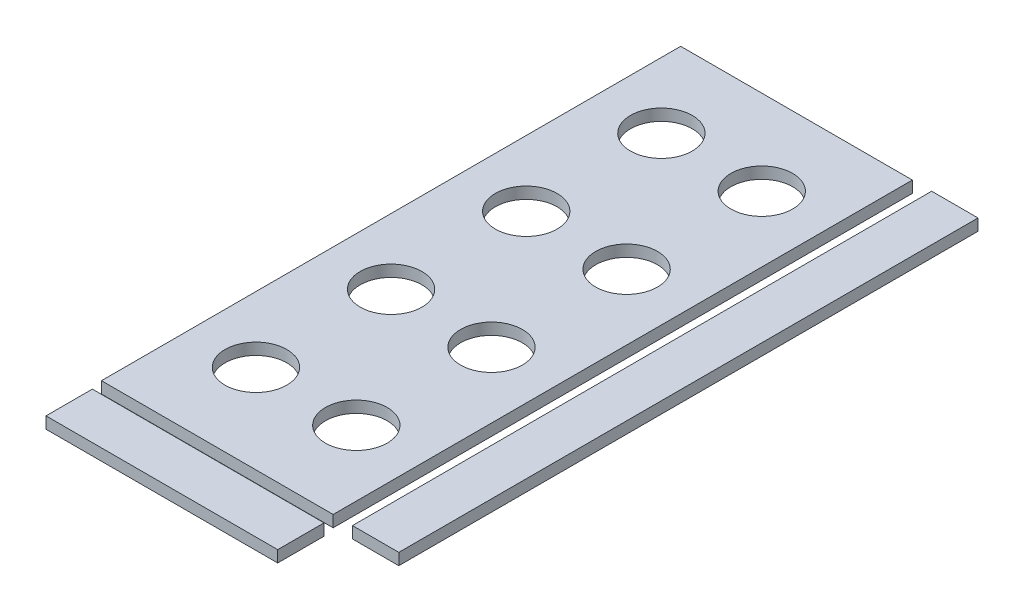
ISO-10303-21;
HEADER;
FILE_DESCRIPTION(('STEP AP214'),'2;1');
FILE_NAME('part.step','',(''),(''),'','','');
FILE_SCHEMA(('AUTOMOTIVE_DESIGN { 1 0 10303 214 1 1 1 1 }'));
ENDSEC;
DATA;
#1=APPLICATION_CONTEXT('core data for automotive mechanical design processes');
#2=APPLICATION_PROTOCOL_DEFINITION('international standard','automotive_design',2000,#1);
#3=PRODUCT_CONTEXT('',#1,'mechanical');
#4=PRODUCT('Part','Part','',(#3));
#5=PRODUCT_RELATED_PRODUCT_CATEGORY('part','',(#4));
#6=PRODUCT_DEFINITION_FORMATION('','',#4);
#7=PRODUCT_DEFINITION_CONTEXT('part definition',#1,'design');
#8=PRODUCT_DEFINITION('design','',#6,#7);
#9=PRODUCT_DEFINITION_SHAPE('','',#8);
#10=(LENGTH_UNIT() NAMED_UNIT(*) SI_UNIT(.MILLI.,.METRE.));
#11=(NAMED_UNIT(*) PLANE_ANGLE_UNIT() SI_UNIT($,.RADIAN.));
#12=(NAMED_UNIT(*) SI_UNIT($,.STERADIAN.) SOLID_ANGLE_UNIT());
#13=UNCERTAINTY_MEASURE_WITH_UNIT(LENGTH_MEASURE(1.E-05),#10,'distance_accuracy_value','');
#14=(GEOMETRIC_REPRESENTATION_CONTEXT(3) GLOBAL_UNCERTAINTY_ASSIGNED_CONTEXT((#13)) GLOBAL_UNIT_ASSIGNED_CONTEXT((#10,
#11,#12)) REPRESENTATION_CONTEXT('',''));
#15=CARTESIAN_POINT('',(0.,0.,0.));
#16=DIRECTION('',(0.,0.,1.));
#17=DIRECTION('',(1.,0.,0.));
#18=AXIS2_PLACEMENT_3D('',#15,#16,#17);
#19=CARTESIAN_POINT('',(-37.6701485217803,3.,27.4288459978406));
#20=DIRECTION('',(-3.66736733573939E-13,0.,-1.));
#21=DIRECTION('',(-1.,0.,3.66736733573939E-13));
#22=AXIS2_PLACEMENT_3D('',#19,#20,#21);
#23=PLANE('',#22);
#24=DIRECTION('',(1.,0.,-3.66736733573939E-13));
#25=VECTOR('',#24,1.);
#26=CARTESIAN_POINT('',(-37.6701485217803,0.,27.4288459978406));
#27=LINE('',#26,#25);
#28=CARTESIAN_POINT('',(-37.6701485217803,0.,27.4288459978406));
#29=VERTEX_POINT('',#28);
#30=CARTESIAN_POINT('',(22.3298514782197,0.,27.4288459978186));
#31=VERTEX_POINT('',#30);
#32=EDGE_CURVE('E107',#29,#31,#27,.T.);
#33=ORIENTED_EDGE('',*,*,#32,.T.);
#34=DIRECTION('',(0.,-1.,0.));
#35=VECTOR('',#34,1.);
#36=CARTESIAN_POINT('',(22.3298514782197,3.,27.4288459978186));
#37=LINE('',#36,#35);
#38=CARTESIAN_POINT('',(22.3298514782197,3.,27.4288459978186));
#39=VERTEX_POINT('',#38);
#40=EDGE_CURVE('E12',#39,#31,#37,.T.);
#41=ORIENTED_EDGE('',*,*,#40,.F.);
#42=DIRECTION('',(1.,0.,-3.66736733573939E-13));
#43=VECTOR('',#42,1.);
#44=CARTESIAN_POINT('',(-37.6701485217803,3.,27.4288459978406));
#45=LINE('',#44,#43);
#46=CARTESIAN_POINT('',(-37.6701485217803,3.,27.4288459978406));
#47=VERTEX_POINT('',#46);
#48=EDGE_CURVE('E95',#47,#39,#45,.T.);
#49=ORIENTED_EDGE('',*,*,#48,.F.);
#50=DIRECTION('',(0.,-1.,0.));
#51=VECTOR('',#50,1.);
#52=CARTESIAN_POINT('',(-37.6701485217803,3.,27.4288459978406));
#53=LINE('',#52,#51);
#54=EDGE_CURVE('E103',#47,#29,#53,.T.);
#55=ORIENTED_EDGE('',*,*,#54,.T.);
#56=EDGE_LOOP('',(#33,#41,#49,#55));
#57=FACE_BOUND('',#56,.T.);
#58=ADVANCED_FACE('F44',(#57),#23,.F.);
#59=CARTESIAN_POINT('',(22.3298514782197,3.,27.4288459978186));
#60=DIRECTION('',(-1.,0.,3.66505437110476E-13));
#61=DIRECTION('',(3.66505437110476E-13,0.,1.));
#62=AXIS2_PLACEMENT_3D('',#59,#60,#61);
#63=PLANE('',#62);
#64=DIRECTION('',(-3.66505437110476E-13,0.,-1.));
#65=VECTOR('',#64,1.);
#66=CARTESIAN_POINT('',(22.3298514782197,0.,27.4288459978186));
#67=LINE('',#66,#65);
#68=CARTESIAN_POINT('',(22.3298514782153,0.,15.4288459978186));
#69=VERTEX_POINT('',#68);
#70=EDGE_CURVE('E99',#31,#69,#67,.T.);
#71=ORIENTED_EDGE('',*,*,#70,.T.);
#72=DIRECTION('',(0.,-1.,0.));
#73=VECTOR('',#72,1.);
#74=CARTESIAN_POINT('',(22.3298514782153,3.,15.4288459978186));
#75=LINE('',#74,#73);
#76=CARTESIAN_POINT('',(22.3298514782153,3.,15.4288459978186));
#77=VERTEX_POINT('',#76);
#78=EDGE_CURVE('E52',#77,#69,#75,.T.);
#79=ORIENTED_EDGE('',*,*,#78,.F.);
#80=DIRECTION('',(-3.66505437110476E-13,0.,-1.));
#81=VECTOR('',#80,1.);
#82=CARTESIAN_POINT('',(22.3298514782197,3.,27.4288459978186));
#83=LINE('',#82,#81);
#84=EDGE_CURVE('E90',#39,#77,#83,.T.);
#85=ORIENTED_EDGE('',*,*,#84,.F.);
#86=ORIENTED_EDGE('',*,*,#40,.T.);
#87=EDGE_LOOP('',(#71,#79,#85,#86));
#88=FACE_BOUND('',#87,.T.);
#89=ADVANCED_FACE('F98',(#88),#63,.F.);
#90=CARTESIAN_POINT('',(-37.6701485217847,3.,15.4288459978406));
#91=DIRECTION('',(3.66505437110476E-13,0.,1.));
#92=DIRECTION('',(1.,0.,-3.66505437110476E-13));
#93=AXIS2_PLACEMENT_3D('',#90,#91,#92);
#94=PLANE('',#93);
#95=DIRECTION('',(-1.,0.,3.66505437110476E-13));
#96=VECTOR('',#95,1.);
#97=CARTESIAN_POINT('',(-37.6701485217847,0.,15.4288459978406));
#98=LINE('',#97,#96);
#99=CARTESIAN_POINT('',(-37.6701485217847,0.,15.4288459978406));
#100=VERTEX_POINT('',#99);
#101=EDGE_CURVE('E77',#69,#100,#98,.T.);
#102=ORIENTED_EDGE('',*,*,#101,.T.);
#103=DIRECTION('',(0.,-1.,0.));
#104=VECTOR('',#103,1.);
#105=CARTESIAN_POINT('',(-37.6701485217847,3.,15.4288459978406));
#106=LINE('',#105,#104);
#107=CARTESIAN_POINT('',(-37.6701485217847,3.,15.4288459978406));
#108=VERTEX_POINT('',#107);
#109=EDGE_CURVE('E100',#108,#100,#106,.T.);
#110=ORIENTED_EDGE('',*,*,#109,.F.);
#111=DIRECTION('',(-1.,0.,3.66505437110476E-13));
#112=VECTOR('',#111,1.);
#113=CARTESIAN_POINT('',(-37.6701485217847,3.,15.4288459978406));
#114=LINE('',#113,#112);
#115=EDGE_CURVE('E93',#77,#108,#114,.T.);
#116=ORIENTED_EDGE('',*,*,#115,.F.);
#117=ORIENTED_EDGE('',*,*,#78,.T.);
#118=EDGE_LOOP('',(#102,#110,#116,#117));
#119=FACE_BOUND('',#118,.T.);
#120=ADVANCED_FACE('F101',(#119),#94,.F.);
#121=CARTESIAN_POINT('',(-37.6701485217803,3.,27.4288459978406));
#122=DIRECTION('',(1.,0.,-3.66505437110476E-13));
#123=DIRECTION('',(-3.66505437110476E-13,0.,-1.));
#124=AXIS2_PLACEMENT_3D('',#121,#122,#123);
#125=PLANE('',#124);
#126=DIRECTION('',(3.66505437110476E-13,0.,1.));
#127=VECTOR('',#126,1.);
#128=CARTESIAN_POINT('',(-37.6701485217803,0.,27.4288459978406));
#129=LINE('',#128,#127);
#130=EDGE_CURVE('E83',#100,#29,#129,.T.);
#131=ORIENTED_EDGE('',*,*,#130,.T.);
#132=ORIENTED_EDGE('',*,*,#54,.F.);
#133=DIRECTION('',(3.66505437110476E-13,0.,1.));
#134=VECTOR('',#133,1.);
#135=CARTESIAN_POINT('',(-37.6701485217803,3.,27.4288459978406));
#136=LINE('',#135,#134);
#137=EDGE_CURVE('E60',#108,#47,#136,.T.);
#138=ORIENTED_EDGE('',*,*,#137,.F.);
#139=ORIENTED_EDGE('',*,*,#109,.T.);
#140=EDGE_LOOP('',(#131,#132,#138,#139));
#141=FACE_BOUND('',#140,.T.);
#142=ADVANCED_FACE('F114',(#141),#125,.F.);
#143=CARTESIAN_POINT('',(9.97415725046658,3.,71.0513108964191));
#144=DIRECTION('',(0.,1.,0.));
#145=DIRECTION('',(1.,0.,-3.66505437110476E-13));
#146=AXIS2_PLACEMENT_3D('',#143,#144,#145);
#147=PLANE('',#146);
#148=ORIENTED_EDGE('',*,*,#48,.T.);
#149=ORIENTED_EDGE('',*,*,#84,.T.);
#150=ORIENTED_EDGE('',*,*,#115,.T.);
#151=ORIENTED_EDGE('',*,*,#137,.T.);
#152=EDGE_LOOP('',(#148,#149,#150,#151));
#153=FACE_BOUND('',#152,.T.);
#154=ADVANCED_FACE('F91',(#153),#147,.T.);
#155=CARTESIAN_POINT('',(9.97415725046658,0.,71.0513108964191));
#156=DIRECTION('',(0.,1.,0.));
#157=DIRECTION('',(1.,0.,-3.66505437110476E-13));
#158=AXIS2_PLACEMENT_3D('',#155,#156,#157);
#159=PLANE('',#158);
#160=ORIENTED_EDGE('',*,*,#32,.F.);
#161=ORIENTED_EDGE('',*,*,#130,.F.);
#162=ORIENTED_EDGE('',*,*,#101,.F.);
#163=ORIENTED_EDGE('',*,*,#70,.F.);
#164=EDGE_LOOP('',(#160,#161,#162,#163));
#165=FACE_BOUND('',#164,.T.);
#166=ADVANCED_FACE('F117',(#165),#159,.F.);
#167=CLOSED_SHELL('',(#58,#89,#120,#142,#154,#166));
#168=MANIFOLD_SOLID_BREP('B2',#167);
#169=CARTESIAN_POINT('',(26.6224648985959,3.,-137.644305772231));
#170=DIRECTION('',(1.,0.,0.));
#171=DIRECTION('',(0.,0.,-1.));
#172=AXIS2_PLACEMENT_3D('',#169,#170,#171);
#173=PLANE('',#172);
#174=DIRECTION('',(0.,0.,1.));
#175=VECTOR('',#174,1.);
#176=CARTESIAN_POINT('',(26.6224648985959,0.,-137.644305772231));
#177=LINE('',#176,#175);
#178=CARTESIAN_POINT('',(26.6224648985959,0.,-137.644305772231));
#179=VERTEX_POINT('',#178);
#180=CARTESIAN_POINT('',(26.622464898596,0.,12.3556942277691));
#181=VERTEX_POINT('',#180);
#182=EDGE_CURVE('E240',#179,#181,#177,.T.);
#183=ORIENTED_EDGE('',*,*,#182,.T.);
#184=DIRECTION('',(0.,-1.,0.));
#185=VECTOR('',#184,1.);
#186=CARTESIAN_POINT('',(26.622464898596,3.,12.3556942277691));
#187=LINE('',#186,#185);
#188=CARTESIAN_POINT('',(26.622464898596,3.,12.3556942277691));
#189=VERTEX_POINT('',#188);
#190=EDGE_CURVE('E42',#189,#181,#187,.T.);
#191=ORIENTED_EDGE('',*,*,#190,.F.);
#192=DIRECTION('',(0.,0.,1.));
#193=VECTOR('',#192,1.);
#194=CARTESIAN_POINT('',(26.6224648985959,3.,-137.644305772231));
#195=LINE('',#194,#193);
#196=CARTESIAN_POINT('',(26.6224648985959,3.,-137.644305772231));
#197=VERTEX_POINT('',#196);
#198=EDGE_CURVE('E228',#197,#189,#195,.T.);
#199=ORIENTED_EDGE('',*,*,#198,.F.);
#200=DIRECTION('',(0.,-1.,0.));
#201=VECTOR('',#200,1.);
#202=CARTESIAN_POINT('',(26.6224648985959,3.,-137.644305772231));
#203=LINE('',#202,#201);
#204=EDGE_CURVE('E236',#197,#179,#203,.T.);
#205=ORIENTED_EDGE('',*,*,#204,.T.);
#206=EDGE_LOOP('',(#183,#191,#199,#205));
#207=FACE_BOUND('',#206,.T.);
#208=ADVANCED_FACE('F177',(#207),#173,.F.);
#209=CARTESIAN_POINT('',(26.622464898596,3.,12.3556942277691));
#210=DIRECTION('',(0.,0.,-1.));
#211=DIRECTION('',(-1.,0.,0.));
#212=AXIS2_PLACEMENT_3D('',#209,#210,#211);
#213=PLANE('',#212);
#214=DIRECTION('',(1.,0.,0.));
#215=VECTOR('',#214,1.);
#216=CARTESIAN_POINT('',(26.622464898596,0.,12.3556942277691));
#217=LINE('',#216,#215);
#218=CARTESIAN_POINT('',(38.622464898596,0.,12.3556942277691));
#219=VERTEX_POINT('',#218);
#220=EDGE_CURVE('E232',#181,#219,#217,.T.);
#221=ORIENTED_EDGE('',*,*,#220,.T.);
#222=DIRECTION('',(0.,-1.,0.));
#223=VECTOR('',#222,1.);
#224=CARTESIAN_POINT('',(38.622464898596,3.,12.3556942277691));
#225=LINE('',#224,#223);
#226=CARTESIAN_POINT('',(38.622464898596,3.,12.3556942277691));
#227=VERTEX_POINT('',#226);
#228=EDGE_CURVE('E185',#227,#219,#225,.T.);
#229=ORIENTED_EDGE('',*,*,#228,.F.);
#230=DIRECTION('',(1.,0.,0.));
#231=VECTOR('',#230,1.);
#232=CARTESIAN_POINT('',(26.622464898596,3.,12.3556942277691));
#233=LINE('',#232,#231);
#234=EDGE_CURVE('E223',#189,#227,#233,.T.);
#235=ORIENTED_EDGE('',*,*,#234,.F.);
#236=ORIENTED_EDGE('',*,*,#190,.T.);
#237=EDGE_LOOP('',(#221,#229,#235,#236));
#238=FACE_BOUND('',#237,.T.);
#239=ADVANCED_FACE('F231',(#238),#213,.F.);
#240=CARTESIAN_POINT('',(38.6224648985959,3.,-137.644305772231));
#241=DIRECTION('',(-1.,0.,0.));
#242=DIRECTION('',(0.,0.,1.));
#243=AXIS2_PLACEMENT_3D('',#240,#241,#242);
#244=PLANE('',#243);
#245=DIRECTION('',(0.,0.,-1.));
#246=VECTOR('',#245,1.);
#247=CARTESIAN_POINT('',(38.6224648985959,0.,-137.644305772231));
#248=LINE('',#247,#246);
#249=CARTESIAN_POINT('',(38.6224648985959,0.,-137.644305772231));
#250=VERTEX_POINT('',#249);
#251=EDGE_CURVE('E210',#219,#250,#248,.T.);
#252=ORIENTED_EDGE('',*,*,#251,.T.);
#253=DIRECTION('',(0.,-1.,0.));
#254=VECTOR('',#253,1.);
#255=CARTESIAN_POINT('',(38.6224648985959,3.,-137.644305772231));
#256=LINE('',#255,#254);
#257=CARTESIAN_POINT('',(38.6224648985959,3.,-137.644305772231));
#258=VERTEX_POINT('',#257);
#259=EDGE_CURVE('E233',#258,#250,#256,.T.);
#260=ORIENTED_EDGE('',*,*,#259,.F.);
#261=DIRECTION('',(0.,0.,-1.));
#262=VECTOR('',#261,1.);
#263=CARTESIAN_POINT('',(38.6224648985959,3.,-137.644305772231));
#264=LINE('',#263,#262);
#265=EDGE_CURVE('E226',#227,#258,#264,.T.);
#266=ORIENTED_EDGE('',*,*,#265,.F.);
#267=ORIENTED_EDGE('',*,*,#228,.T.);
#268=EDGE_LOOP('',(#252,#260,#266,#267));
#269=FACE_BOUND('',#268,.T.);
#270=ADVANCED_FACE('F234',(#269),#244,.F.);
#271=CARTESIAN_POINT('',(26.6224648985959,3.,-137.644305772231));
#272=DIRECTION('',(0.,0.,1.));
#273=DIRECTION('',(1.,0.,0.));
#274=AXIS2_PLACEMENT_3D('',#271,#272,#273);
#275=PLANE('',#274);
#276=DIRECTION('',(-1.,0.,0.));
#277=VECTOR('',#276,1.);
#278=CARTESIAN_POINT('',(26.6224648985959,0.,-137.644305772231));
#279=LINE('',#278,#277);
#280=EDGE_CURVE('E216',#250,#179,#279,.T.);
#281=ORIENTED_EDGE('',*,*,#280,.T.);
#282=ORIENTED_EDGE('',*,*,#204,.F.);
#283=DIRECTION('',(-1.,0.,0.));
#284=VECTOR('',#283,1.);
#285=CARTESIAN_POINT('',(26.6224648985959,3.,-137.644305772231));
#286=LINE('',#285,#284);
#287=EDGE_CURVE('E193',#258,#197,#286,.T.);
#288=ORIENTED_EDGE('',*,*,#287,.F.);
#289=ORIENTED_EDGE('',*,*,#259,.T.);
#290=EDGE_LOOP('',(#281,#282,#288,#289));
#291=FACE_BOUND('',#290,.T.);
#292=ADVANCED_FACE('F247',(#291),#275,.F.);
#293=CARTESIAN_POINT('',(0.,3.,0.));
#294=DIRECTION('',(0.,1.,0.));
#295=DIRECTION('',(0.,0.,1.));
#296=AXIS2_PLACEMENT_3D('',#293,#294,#295);
#297=PLANE('',#296);
#298=ORIENTED_EDGE('',*,*,#198,.T.);
#299=ORIENTED_EDGE('',*,*,#234,.T.);
#300=ORIENTED_EDGE('',*,*,#265,.T.);
#301=ORIENTED_EDGE('',*,*,#287,.T.);
#302=EDGE_LOOP('',(#298,#299,#300,#301));
#303=FACE_BOUND('',#302,.T.);
#304=ADVANCED_FACE('F224',(#303),#297,.T.);
#305=CARTESIAN_POINT('',(0.,0.,0.));
#306=DIRECTION('',(0.,1.,0.));
#307=DIRECTION('',(0.,0.,1.));
#308=AXIS2_PLACEMENT_3D('',#305,#306,#307);
#309=PLANE('',#308);
#310=ORIENTED_EDGE('',*,*,#182,.F.);
#311=ORIENTED_EDGE('',*,*,#280,.F.);
#312=ORIENTED_EDGE('',*,*,#251,.F.);
#313=ORIENTED_EDGE('',*,*,#220,.F.);
#314=EDGE_LOOP('',(#310,#311,#312,#313));
#315=FACE_BOUND('',#314,.T.);
#316=ADVANCED_FACE('F250',(#315),#309,.F.);
#317=CLOSED_SHELL('',(#208,#239,#270,#292,#304,#316));
#318=MANIFOLD_SOLID_BREP('B6',#317);
#319=CARTESIAN_POINT('',(-38.3775351014041,3.,-137.644305772231));
#320=DIRECTION('',(1.,0.,0.));
#321=DIRECTION('',(0.,0.,-1.));
#322=AXIS2_PLACEMENT_3D('',#319,#320,#321);
#323=PLANE('',#322);
#324=DIRECTION('',(0.,0.,1.));
#325=VECTOR('',#324,1.);
#326=CARTESIAN_POINT('',(-38.3775351014041,0.,-137.644305772231));
#327=LINE('',#326,#325);
#328=CARTESIAN_POINT('',(-38.3775351014041,0.,-137.644305772231));
#329=VERTEX_POINT('',#328);
#330=CARTESIAN_POINT('',(-38.3775351014041,0.,12.3556942277691));
#331=VERTEX_POINT('',#330);
#332=EDGE_CURVE('E370',#329,#331,#327,.T.);
#333=ORIENTED_EDGE('',*,*,#332,.T.);
#334=DIRECTION('',(0.,-1.,0.));
#335=VECTOR('',#334,1.);
#336=CARTESIAN_POINT('',(-38.3775351014041,3.,12.3556942277691));
#337=LINE('',#336,#335);
#338=CARTESIAN_POINT('',(-38.3775351014041,3.,12.3556942277691));
#339=VERTEX_POINT('',#338);
#340=EDGE_CURVE('E175',#339,#331,#337,.T.);
#341=ORIENTED_EDGE('',*,*,#340,.F.);
#342=DIRECTION('',(0.,0.,1.));
#343=VECTOR('',#342,1.);
#344=CARTESIAN_POINT('',(-38.3775351014041,3.,-137.644305772231));
#345=LINE('',#344,#343);
#346=CARTESIAN_POINT('',(-38.3775351014041,3.,-137.644305772231));
#347=VERTEX_POINT('',#346);
#348=EDGE_CURVE('E358',#347,#339,#345,.T.);
#349=ORIENTED_EDGE('',*,*,#348,.F.);
#350=DIRECTION('',(0.,-1.,0.));
#351=VECTOR('',#350,1.);
#352=CARTESIAN_POINT('',(-38.3775351014041,3.,-137.644305772231));
#353=LINE('',#352,#351);
#354=EDGE_CURVE('E366',#347,#329,#353,.T.);
#355=ORIENTED_EDGE('',*,*,#354,.T.);
#356=EDGE_LOOP('',(#333,#341,#349,#355));
#357=FACE_BOUND('',#356,.T.);
#358=ADVANCED_FACE('F307',(#357),#323,.F.);
#359=CARTESIAN_POINT('',(-38.3775351014041,3.,12.3556942277691));
#360=DIRECTION('',(0.,0.,-1.));
#361=DIRECTION('',(-1.,0.,0.));
#362=AXIS2_PLACEMENT_3D('',#359,#360,#361);
#363=PLANE('',#362);
#364=DIRECTION('',(1.,0.,0.));
#365=VECTOR('',#364,1.);
#366=CARTESIAN_POINT('',(-38.3775351014041,0.,12.3556942277691));
#367=LINE('',#366,#365);
#368=CARTESIAN_POINT('',(21.6224648985959,0.,12.3556942277691));
#369=VERTEX_POINT('',#368);
#370=EDGE_CURVE('E362',#331,#369,#367,.T.);
#371=ORIENTED_EDGE('',*,*,#370,.T.);
#372=DIRECTION('',(0.,-1.,0.));
#373=VECTOR('',#372,1.);
#374=CARTESIAN_POINT('',(21.6224648985959,3.,12.3556942277691));
#375=LINE('',#374,#373);
#376=CARTESIAN_POINT('',(21.6224648985959,3.,12.3556942277691));
#377=VERTEX_POINT('',#376);
#378=EDGE_CURVE('E315',#377,#369,#375,.T.);
#379=ORIENTED_EDGE('',*,*,#378,.F.);
#380=DIRECTION('',(1.,0.,0.));
#381=VECTOR('',#380,1.);
#382=CARTESIAN_POINT('',(-38.3775351014041,3.,12.3556942277691));
#383=LINE('',#382,#381);
#384=EDGE_CURVE('E353',#339,#377,#383,.T.);
#385=ORIENTED_EDGE('',*,*,#384,.F.);
#386=ORIENTED_EDGE('',*,*,#340,.T.);
#387=EDGE_LOOP('',(#371,#379,#385,#386));
#388=FACE_BOUND('',#387,.T.);
#389=ADVANCED_FACE('F361',(#388),#363,.F.);
#390=CARTESIAN_POINT('',(21.6224648985959,3.,-137.644305772231));
#391=DIRECTION('',(-1.,0.,0.));
#392=DIRECTION('',(0.,0.,1.));
#393=AXIS2_PLACEMENT_3D('',#390,#391,#392);
#394=PLANE('',#393);
#395=DIRECTION('',(0.,0.,-1.));
#396=VECTOR('',#395,1.);
#397=CARTESIAN_POINT('',(21.6224648985959,0.,-137.644305772231));
#398=LINE('',#397,#396);
#399=CARTESIAN_POINT('',(21.6224648985959,0.,-137.644305772231));
#400=VERTEX_POINT('',#399);
#401=EDGE_CURVE('E340',#369,#400,#398,.T.);
#402=ORIENTED_EDGE('',*,*,#401,.T.);
#403=DIRECTION('',(0.,-1.,0.));
#404=VECTOR('',#403,1.);
#405=CARTESIAN_POINT('',(21.6224648985959,3.,-137.644305772231));
#406=LINE('',#405,#404);
#407=CARTESIAN_POINT('',(21.6224648985959,3.,-137.644305772231));
#408=VERTEX_POINT('',#407);
#409=EDGE_CURVE('E363',#408,#400,#406,.T.);
#410=ORIENTED_EDGE('',*,*,#409,.F.);
#411=DIRECTION('',(0.,0.,-1.));
#412=VECTOR('',#411,1.);
#413=CARTESIAN_POINT('',(21.6224648985959,3.,-137.644305772231));
#414=LINE('',#413,#412);
#415=EDGE_CURVE('E356',#377,#408,#414,.T.);
#416=ORIENTED_EDGE('',*,*,#415,.F.);
#417=ORIENTED_EDGE('',*,*,#378,.T.);
#418=EDGE_LOOP('',(#402,#410,#416,#417));
#419=FACE_BOUND('',#418,.T.);
#420=ADVANCED_FACE('F364',(#419),#394,.F.);
#421=CARTESIAN_POINT('',(-38.3775351014041,3.,-137.644305772231));
#422=DIRECTION('',(0.,0.,1.));
#423=DIRECTION('',(1.,0.,0.));
#424=AXIS2_PLACEMENT_3D('',#421,#422,#423);
#425=PLANE('',#424);
#426=DIRECTION('',(-1.,0.,0.));
#427=VECTOR('',#426,1.);
#428=CARTESIAN_POINT('',(-38.3775351014041,0.,-137.644305772231));
#429=LINE('',#428,#427);
#430=EDGE_CURVE('E346',#400,#329,#429,.T.);
#431=ORIENTED_EDGE('',*,*,#430,.T.);
#432=ORIENTED_EDGE('',*,*,#354,.F.);
#433=DIRECTION('',(-1.,0.,0.));
#434=VECTOR('',#433,1.);
#435=CARTESIAN_POINT('',(-38.3775351014041,3.,-137.644305772231));
#436=LINE('',#435,#434);
#437=EDGE_CURVE('E323',#408,#347,#436,.T.);
#438=ORIENTED_EDGE('',*,*,#437,.F.);
#439=ORIENTED_EDGE('',*,*,#409,.T.);
#440=EDGE_LOOP('',(#431,#432,#438,#439));
#441=FACE_BOUND('',#440,.T.);
#442=ADVANCED_FACE('F378',(#441),#425,.F.);
#443=CARTESIAN_POINT('',(0.,3.,0.));
#444=DIRECTION('',(0.,1.,0.));
#445=DIRECTION('',(0.,0.,1.));
#446=AXIS2_PLACEMENT_3D('',#443,#444,#445);
#447=PLANE('',#446);
#448=CARTESIAN_POINT('',(4.62246489859569,3.,-80.6443057722309));
#449=DIRECTION('',(0.,1.,0.));
#450=DIRECTION('',(0.,0.,1.));
#451=AXIS2_PLACEMENT_3D('',#448,#449,#450);
#452=CIRCLE('',#451,8.);
#453=CARTESIAN_POINT('',(4.62246489859569,3.,-72.6443057722309));
#454=VERTEX_POINT('',#453);
#455=EDGE_CURVE('E402',#454,#454,#452,.T.);
#456=ORIENTED_EDGE('',*,*,#455,.F.);
#457=EDGE_LOOP('',(#456));
#458=FACE_BOUND('',#457,.T.);
#459=CARTESIAN_POINT('',(-21.3775351014042,3.,-45.6443057722309));
#460=DIRECTION('',(0.,1.,0.));
#461=DIRECTION('',(0.,0.,1.));
#462=AXIS2_PLACEMENT_3D('',#459,#460,#461);
#463=CIRCLE('',#462,8.);
#464=CARTESIAN_POINT('',(-21.3775351014042,3.,-37.6443057722309));
#465=VERTEX_POINT('',#464);
#466=EDGE_CURVE('E409',#465,#465,#463,.T.);
#467=ORIENTED_EDGE('',*,*,#466,.F.);
#468=EDGE_LOOP('',(#467));
#469=FACE_BOUND('',#468,.T.);
#470=CARTESIAN_POINT('',(4.62246489859581,3.,-45.6443057722309));
#471=DIRECTION('',(0.,1.,0.));
#472=DIRECTION('',(0.,0.,1.));
#473=AXIS2_PLACEMENT_3D('',#470,#471,#472);
#474=CIRCLE('',#473,8.);
#475=CARTESIAN_POINT('',(4.62246489859581,3.,-37.6443057722309));
#476=VERTEX_POINT('',#475);
#477=EDGE_CURVE('E390',#476,#476,#474,.T.);
#478=ORIENTED_EDGE('',*,*,#477,.F.);
#479=EDGE_LOOP('',(#478));
#480=FACE_BOUND('',#479,.T.);
#481=CARTESIAN_POINT('',(-21.3775351014041,3.,-10.6443057722309));
#482=DIRECTION('',(0.,1.,0.));
#483=DIRECTION('',(0.,0.,1.));
#484=AXIS2_PLACEMENT_3D('',#481,#482,#483);
#485=CIRCLE('',#484,8.);
#486=CARTESIAN_POINT('',(-21.3775351014041,3.,-2.64430577223089));
#487=VERTEX_POINT('',#486);
#488=EDGE_CURVE('E397',#487,#487,#485,.T.);
#489=ORIENTED_EDGE('',*,*,#488,.F.);
#490=EDGE_LOOP('',(#489));
#491=FACE_BOUND('',#490,.T.);
#492=CARTESIAN_POINT('',(-21.3775351014044,3.,-115.644305772231));
#493=DIRECTION('',(0.,1.,0.));
#494=DIRECTION('',(0.,0.,1.));
#495=AXIS2_PLACEMENT_3D('',#492,#493,#494);
#496=CIRCLE('',#495,8.00000000000001);
#497=CARTESIAN_POINT('',(-21.3775351014044,3.,-107.644305772231));
#498=VERTEX_POINT('',#497);
#499=EDGE_CURVE('E426',#498,#498,#496,.T.);
#500=ORIENTED_EDGE('',*,*,#499,.F.);
#501=EDGE_LOOP('',(#500));
#502=FACE_BOUND('',#501,.T.);
#503=CARTESIAN_POINT('',(4.62246489859557,3.,-115.644305772231));
#504=DIRECTION('',(0.,1.,0.));
#505=DIRECTION('',(0.,0.,1.));
#506=AXIS2_PLACEMENT_3D('',#503,#504,#505);
#507=CIRCLE('',#506,8.);
#508=CARTESIAN_POINT('',(4.62246489859557,3.,-107.644305772231));
#509=VERTEX_POINT('',#508);
#510=EDGE_CURVE('E414',#509,#509,#507,.T.);
#511=ORIENTED_EDGE('',*,*,#510,.F.);
#512=EDGE_LOOP('',(#511));
#513=FACE_BOUND('',#512,.T.);
#514=CARTESIAN_POINT('',(-21.3775351014043,3.,-80.6443057722309));
#515=DIRECTION('',(0.,1.,0.));
#516=DIRECTION('',(0.,0.,1.));
#517=AXIS2_PLACEMENT_3D('',#514,#515,#516);
#518=CIRCLE('',#517,8.);
#519=CARTESIAN_POINT('',(-21.3775351014043,3.,-72.6443057722309));
#520=VERTEX_POINT('',#519);
#521=EDGE_CURVE('E421',#520,#520,#518,.T.);
#522=ORIENTED_EDGE('',*,*,#521,.F.);
#523=EDGE_LOOP('',(#522));
#524=FACE_BOUND('',#523,.T.);
#525=CARTESIAN_POINT('',(4.62246489859593,3.,-10.6443057722309));
#526=DIRECTION('',(0.,1.,0.));
#527=DIRECTION('',(0.,0.,1.));
#528=AXIS2_PLACEMENT_3D('',#525,#526,#527);
#529=CIRCLE('',#528,8.);
#530=CARTESIAN_POINT('',(4.62246489859593,3.,-2.64430577223089));
#531=VERTEX_POINT('',#530);
#532=EDGE_CURVE('E384',#531,#531,#529,.T.);
#533=ORIENTED_EDGE('',*,*,#532,.F.);
#534=EDGE_LOOP('',(#533));
#535=FACE_BOUND('',#534,.T.);
#536=ORIENTED_EDGE('',*,*,#348,.T.);
#537=ORIENTED_EDGE('',*,*,#384,.T.);
#538=ORIENTED_EDGE('',*,*,#415,.T.);
#539=ORIENTED_EDGE('',*,*,#437,.T.);
#540=EDGE_LOOP('',(#536,#537,#538,#539));
#541=FACE_BOUND('',#540,.T.);
#542=ADVANCED_FACE('F354',(#458,#469,#480,#491,#502,#513,#524,#535,#541),#447,.T.);
#543=CARTESIAN_POINT('',(0.,0.,0.));
#544=DIRECTION('',(0.,1.,0.));
#545=DIRECTION('',(0.,0.,1.));
#546=AXIS2_PLACEMENT_3D('',#543,#544,#545);
#547=PLANE('',#546);
#548=CARTESIAN_POINT('',(4.62246489859569,0.,-80.6443057722309));
#549=DIRECTION('',(0.,1.,0.));
#550=DIRECTION('',(0.,0.,1.));
#551=AXIS2_PLACEMENT_3D('',#548,#549,#550);
#552=CIRCLE('',#551,8.);
#553=CARTESIAN_POINT('',(4.62246489859569,0.,-72.6443057722309));
#554=VERTEX_POINT('',#553);
#555=EDGE_CURVE('E405',#554,#554,#552,.T.);
#556=ORIENTED_EDGE('',*,*,#555,.T.);
#557=EDGE_LOOP('',(#556));
#558=FACE_BOUND('',#557,.T.);
#559=CARTESIAN_POINT('',(-21.3775351014042,0.,-45.6443057722309));
#560=DIRECTION('',(0.,1.,0.));
#561=DIRECTION('',(0.,0.,1.));
#562=AXIS2_PLACEMENT_3D('',#559,#560,#561);
#563=CIRCLE('',#562,8.);
#564=CARTESIAN_POINT('',(-21.3775351014042,0.,-37.6443057722309));
#565=VERTEX_POINT('',#564);
#566=EDGE_CURVE('E394',#565,#565,#563,.T.);
#567=ORIENTED_EDGE('',*,*,#566,.T.);
#568=EDGE_LOOP('',(#567));
#569=FACE_BOUND('',#568,.T.);
#570=CARTESIAN_POINT('',(4.62246489859581,0.,-45.6443057722309));
#571=DIRECTION('',(0.,1.,0.));
#572=DIRECTION('',(0.,0.,1.));
#573=AXIS2_PLACEMENT_3D('',#570,#571,#572);
#574=CIRCLE('',#573,8.);
#575=CARTESIAN_POINT('',(4.62246489859581,0.,-37.6443057722309));
#576=VERTEX_POINT('',#575);
#577=EDGE_CURVE('E393',#576,#576,#574,.T.);
#578=ORIENTED_EDGE('',*,*,#577,.T.);
#579=EDGE_LOOP('',(#578));
#580=FACE_BOUND('',#579,.T.);
#581=CARTESIAN_POINT('',(-21.3775351014041,0.,-10.6443057722309));
#582=DIRECTION('',(0.,1.,0.));
#583=DIRECTION('',(0.,0.,1.));
#584=AXIS2_PLACEMENT_3D('',#581,#582,#583);
#585=CIRCLE('',#584,8.);
#586=CARTESIAN_POINT('',(-21.3775351014041,0.,-2.64430577223089));
#587=VERTEX_POINT('',#586);
#588=EDGE_CURVE('E387',#587,#587,#585,.T.);
#589=ORIENTED_EDGE('',*,*,#588,.T.);
#590=EDGE_LOOP('',(#589));
#591=FACE_BOUND('',#590,.T.);
#592=CARTESIAN_POINT('',(-21.3775351014044,0.,-115.644305772231));
#593=DIRECTION('',(0.,1.,0.));
#594=DIRECTION('',(0.,0.,1.));
#595=AXIS2_PLACEMENT_3D('',#592,#593,#594);
#596=CIRCLE('',#595,8.00000000000001);
#597=CARTESIAN_POINT('',(-21.3775351014044,0.,-107.644305772231));
#598=VERTEX_POINT('',#597);
#599=EDGE_CURVE('E418',#598,#598,#596,.T.);
#600=ORIENTED_EDGE('',*,*,#599,.T.);
#601=EDGE_LOOP('',(#600));
#602=FACE_BOUND('',#601,.T.);
#603=CARTESIAN_POINT('',(4.62246489859557,0.,-115.644305772231));
#604=DIRECTION('',(0.,1.,0.));
#605=DIRECTION('',(0.,0.,1.));
#606=AXIS2_PLACEMENT_3D('',#603,#604,#605);
#607=CIRCLE('',#606,8.);
#608=CARTESIAN_POINT('',(4.62246489859557,0.,-107.644305772231));
#609=VERTEX_POINT('',#608);
#610=EDGE_CURVE('E417',#609,#609,#607,.T.);
#611=ORIENTED_EDGE('',*,*,#610,.T.);
#612=EDGE_LOOP('',(#611));
#613=FACE_BOUND('',#612,.T.);
#614=CARTESIAN_POINT('',(-21.3775351014043,0.,-80.6443057722309));
#615=DIRECTION('',(0.,1.,0.));
#616=DIRECTION('',(0.,0.,1.));
#617=AXIS2_PLACEMENT_3D('',#614,#615,#616);
#618=CIRCLE('',#617,8.);
#619=CARTESIAN_POINT('',(-21.3775351014043,0.,-72.6443057722309));
#620=VERTEX_POINT('',#619);
#621=EDGE_CURVE('E406',#620,#620,#618,.T.);
#622=ORIENTED_EDGE('',*,*,#621,.T.);
#623=EDGE_LOOP('',(#622));
#624=FACE_BOUND('',#623,.T.);
#625=CARTESIAN_POINT('',(4.62246489859593,0.,-10.6443057722309));
#626=DIRECTION('',(0.,1.,0.));
#627=DIRECTION('',(0.,0.,1.));
#628=AXIS2_PLACEMENT_3D('',#625,#626,#627);
#629=CIRCLE('',#628,8.);
#630=CARTESIAN_POINT('',(4.62246489859593,0.,-2.64430577223089));
#631=VERTEX_POINT('',#630);
#632=EDGE_CURVE('E373',#631,#631,#629,.T.);
#633=ORIENTED_EDGE('',*,*,#632,.T.);
#634=EDGE_LOOP('',(#633));
#635=FACE_BOUND('',#634,.T.);
#636=ORIENTED_EDGE('',*,*,#332,.F.);
#637=ORIENTED_EDGE('',*,*,#430,.F.);
#638=ORIENTED_EDGE('',*,*,#401,.F.);
#639=ORIENTED_EDGE('',*,*,#370,.F.);
#640=EDGE_LOOP('',(#636,#637,#638,#639));
#641=FACE_BOUND('',#640,.T.);
#642=ADVANCED_FACE('F381',(#558,#569,#580,#591,#602,#613,#624,#635,#641),#547,.F.);
#643=CARTESIAN_POINT('',(4.62246489859593,0.,-10.6443057722309));
#644=DIRECTION('',(0.,1.,0.));
#645=DIRECTION('',(0.,0.,1.));
#646=AXIS2_PLACEMENT_3D('',#643,#644,#645);
#647=CYLINDRICAL_SURFACE('',#646,8.);
#648=ORIENTED_EDGE('',*,*,#632,.F.);
#649=EDGE_LOOP('',(#648));
#650=FACE_BOUND('',#649,.T.);
#651=ORIENTED_EDGE('',*,*,#532,.T.);
#652=EDGE_LOOP('',(#651));
#653=FACE_BOUND('',#652,.T.);
#654=ADVANCED_FACE('F452',(#650,#653),#647,.F.);
#655=CARTESIAN_POINT('',(-21.3775351014043,0.,-80.6443057722309));
#656=DIRECTION('',(0.,1.,0.));
#657=DIRECTION('',(0.,0.,1.));
#658=AXIS2_PLACEMENT_3D('',#655,#656,#657);
#659=CYLINDRICAL_SURFACE('',#658,8.);
#660=ORIENTED_EDGE('',*,*,#621,.F.);
#661=EDGE_LOOP('',(#660));
#662=FACE_BOUND('',#661,.T.);
#663=ORIENTED_EDGE('',*,*,#521,.T.);
#664=EDGE_LOOP('',(#663));
#665=FACE_BOUND('',#664,.T.);
#666=ADVANCED_FACE('F454',(#662,#665),#659,.F.);
#667=CARTESIAN_POINT('',(4.62246489859557,0.,-115.644305772231));
#668=DIRECTION('',(0.,1.,0.));
#669=DIRECTION('',(0.,0.,1.));
#670=AXIS2_PLACEMENT_3D('',#667,#668,#669);
#671=CYLINDRICAL_SURFACE('',#670,8.);
#672=ORIENTED_EDGE('',*,*,#610,.F.);
#673=EDGE_LOOP('',(#672));
#674=FACE_BOUND('',#673,.T.);
#675=ORIENTED_EDGE('',*,*,#510,.T.);
#676=EDGE_LOOP('',(#675));
#677=FACE_BOUND('',#676,.T.);
#678=ADVANCED_FACE('F438',(#674,#677),#671,.F.);
#679=CARTESIAN_POINT('',(-21.3775351014044,0.,-115.644305772231));
#680=DIRECTION('',(0.,1.,0.));
#681=DIRECTION('',(0.,0.,1.));
#682=AXIS2_PLACEMENT_3D('',#679,#680,#681);
#683=CYLINDRICAL_SURFACE('',#682,8.00000000000001);
#684=ORIENTED_EDGE('',*,*,#599,.F.);
#685=EDGE_LOOP('',(#684));
#686=FACE_BOUND('',#685,.T.);
#687=ORIENTED_EDGE('',*,*,#499,.T.);
#688=EDGE_LOOP('',(#687));
#689=FACE_BOUND('',#688,.T.);
#690=ADVANCED_FACE('F434',(#686,#689),#683,.F.);
#691=CARTESIAN_POINT('',(-21.3775351014041,0.,-10.6443057722309));
#692=DIRECTION('',(0.,1.,0.));
#693=DIRECTION('',(0.,0.,1.));
#694=AXIS2_PLACEMENT_3D('',#691,#692,#693);
#695=CYLINDRICAL_SURFACE('',#694,8.);
#696=ORIENTED_EDGE('',*,*,#588,.F.);
#697=EDGE_LOOP('',(#696));
#698=FACE_BOUND('',#697,.T.);
#699=ORIENTED_EDGE('',*,*,#488,.T.);
#700=EDGE_LOOP('',(#699));
#701=FACE_BOUND('',#700,.T.);
#702=ADVANCED_FACE('F437',(#698,#701),#695,.F.);
#703=CARTESIAN_POINT('',(4.62246489859581,0.,-45.6443057722309));
#704=DIRECTION('',(0.,1.,0.));
#705=DIRECTION('',(0.,0.,1.));
#706=AXIS2_PLACEMENT_3D('',#703,#704,#705);
#707=CYLINDRICAL_SURFACE('',#706,8.);
#708=ORIENTED_EDGE('',*,*,#577,.F.);
#709=EDGE_LOOP('',(#708));
#710=FACE_BOUND('',#709,.T.);
#711=ORIENTED_EDGE('',*,*,#477,.T.);
#712=EDGE_LOOP('',(#711));
#713=FACE_BOUND('',#712,.T.);
#714=ADVANCED_FACE('F523',(#710,#713),#707,.F.);
#715=CARTESIAN_POINT('',(-21.3775351014042,0.,-45.6443057722309));
#716=DIRECTION('',(0.,1.,0.));
#717=DIRECTION('',(0.,0.,1.));
#718=AXIS2_PLACEMENT_3D('',#715,#716,#717);
#719=CYLINDRICAL_SURFACE('',#718,8.);
#720=ORIENTED_EDGE('',*,*,#566,.F.);
#721=EDGE_LOOP('',(#720));
#722=FACE_BOUND('',#721,.T.);
#723=ORIENTED_EDGE('',*,*,#466,.T.);
#724=EDGE_LOOP('',(#723));
#725=FACE_BOUND('',#724,.T.);
#726=ADVANCED_FACE('F533',(#722,#725),#719,.F.);
#727=CARTESIAN_POINT('',(4.62246489859569,0.,-80.6443057722309));
#728=DIRECTION('',(0.,1.,0.));
#729=DIRECTION('',(0.,0.,1.));
#730=AXIS2_PLACEMENT_3D('',#727,#728,#729);
#731=CYLINDRICAL_SURFACE('',#730,8.);
#732=ORIENTED_EDGE('',*,*,#555,.F.);
#733=EDGE_LOOP('',(#732));
#734=FACE_BOUND('',#733,.T.);
#735=ORIENTED_EDGE('',*,*,#455,.T.);
#736=EDGE_LOOP('',(#735));
#737=FACE_BOUND('',#736,.T.);
#738=ADVANCED_FACE('F542',(#734,#737),#731,.F.);
#739=CLOSED_SHELL('',(#358,#389,#420,#442,#542,#642,#654,#666,#678,#690,#702,#714,#726,#738));
#740=MANIFOLD_SOLID_BREP('B36',#739);
#741=ADVANCED_BREP_SHAPE_REPRESENTATION('',(#18,#168,#318,#740),#14);
#742=SHAPE_DEFINITION_REPRESENTATION(#9,#741);
ENDSEC;
END-ISO-10303-21;
